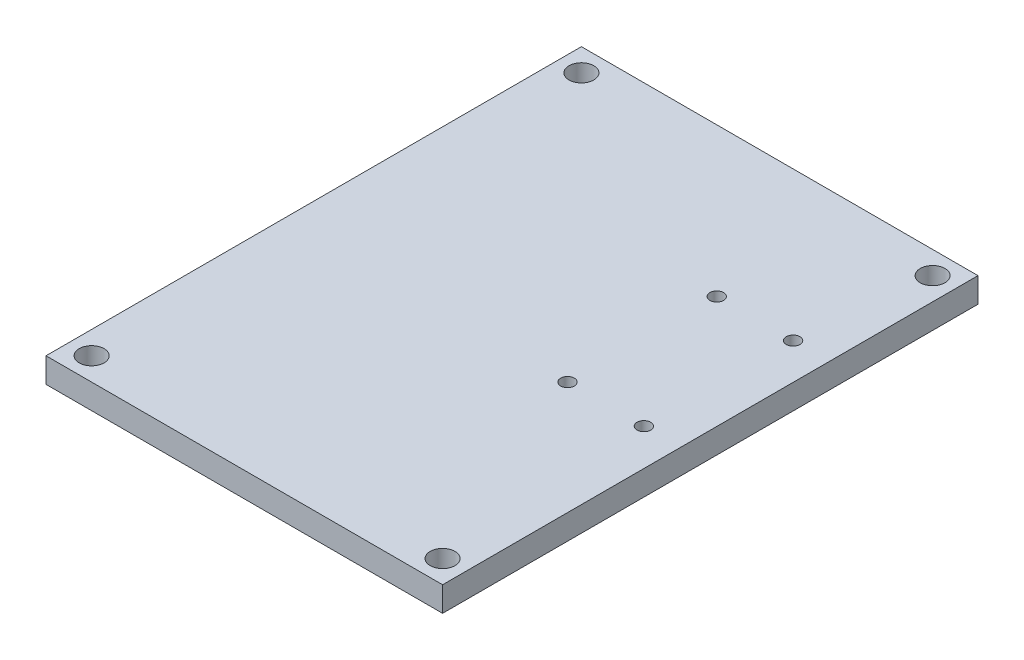
ISO-10303-21;
HEADER;
FILE_DESCRIPTION(('STEP AP214'),'2;1');
FILE_NAME('part.step','',(''),(''),'','','');
FILE_SCHEMA(('AUTOMOTIVE_DESIGN { 1 0 10303 214 1 1 1 1 }'));
ENDSEC;
DATA;
#1=APPLICATION_CONTEXT('core data for automotive mechanical design processes');
#2=APPLICATION_PROTOCOL_DEFINITION('international standard','automotive_design',2000,#1);
#3=PRODUCT_CONTEXT('',#1,'mechanical');
#4=PRODUCT('Part','Part','',(#3));
#5=PRODUCT_RELATED_PRODUCT_CATEGORY('part','',(#4));
#6=PRODUCT_DEFINITION_FORMATION('','',#4);
#7=PRODUCT_DEFINITION_CONTEXT('part definition',#1,'design');
#8=PRODUCT_DEFINITION('design','',#6,#7);
#9=PRODUCT_DEFINITION_SHAPE('','',#8);
#10=(LENGTH_UNIT() NAMED_UNIT(*) SI_UNIT(.MILLI.,.METRE.));
#11=(NAMED_UNIT(*) PLANE_ANGLE_UNIT() SI_UNIT($,.RADIAN.));
#12=(NAMED_UNIT(*) SI_UNIT($,.STERADIAN.) SOLID_ANGLE_UNIT());
#13=UNCERTAINTY_MEASURE_WITH_UNIT(LENGTH_MEASURE(1.E-05),#10,'distance_accuracy_value','');
#14=(GEOMETRIC_REPRESENTATION_CONTEXT(3) GLOBAL_UNCERTAINTY_ASSIGNED_CONTEXT((#13)) GLOBAL_UNIT_ASSIGNED_CONTEXT((#10,
#11,#12)) REPRESENTATION_CONTEXT('',''));
#15=CARTESIAN_POINT('',(0.,0.,0.));
#16=DIRECTION('',(0.,0.,1.));
#17=DIRECTION('',(1.,0.,0.));
#18=AXIS2_PLACEMENT_3D('',#15,#16,#17);
#19=CARTESIAN_POINT('',(-50.8,6.35,-68.58));
#20=DIRECTION('',(0.,0.,-1.));
#21=DIRECTION('',(-1.,0.,0.));
#22=AXIS2_PLACEMENT_3D('',#19,#20,#21);
#23=PLANE('',#22);
#24=DIRECTION('',(1.,0.,0.));
#25=VECTOR('',#24,1.);
#26=CARTESIAN_POINT('',(-50.8,0.,-68.58));
#27=LINE('',#26,#25);
#28=CARTESIAN_POINT('',(-50.8,0.,-68.58));
#29=VERTEX_POINT('',#28);
#30=CARTESIAN_POINT('',(50.8,0.,-68.58));
#31=VERTEX_POINT('',#30);
#32=EDGE_CURVE('E102',#29,#31,#27,.T.);
#33=ORIENTED_EDGE('',*,*,#32,.F.);
#34=DIRECTION('',(0.,-1.,0.));
#35=VECTOR('',#34,1.);
#36=CARTESIAN_POINT('',(-50.8,6.35,-68.58));
#37=LINE('',#36,#35);
#38=CARTESIAN_POINT('',(-50.8,6.35,-68.58));
#39=VERTEX_POINT('',#38);
#40=EDGE_CURVE('E11',#39,#29,#37,.T.);
#41=ORIENTED_EDGE('',*,*,#40,.F.);
#42=DIRECTION('',(1.,0.,0.));
#43=VECTOR('',#42,1.);
#44=CARTESIAN_POINT('',(-50.8,6.35,-68.58));
#45=LINE('',#44,#43);
#46=CARTESIAN_POINT('',(50.8,6.35,-68.58));
#47=VERTEX_POINT('',#46);
#48=EDGE_CURVE('E95',#39,#47,#45,.T.);
#49=ORIENTED_EDGE('',*,*,#48,.T.);
#50=DIRECTION('',(0.,-1.,0.));
#51=VECTOR('',#50,1.);
#52=CARTESIAN_POINT('',(50.8,6.35,-68.58));
#53=LINE('',#52,#51);
#54=EDGE_CURVE('E40',#47,#31,#53,.T.);
#55=ORIENTED_EDGE('',*,*,#54,.T.);
#56=EDGE_LOOP('',(#33,#41,#49,#55));
#57=FACE_BOUND('',#56,.T.);
#58=ADVANCED_FACE('F37',(#57),#23,.T.);
#59=CARTESIAN_POINT('',(-50.8,6.35,68.58));
#60=DIRECTION('',(-1.,0.,0.));
#61=DIRECTION('',(0.,0.,1.));
#62=AXIS2_PLACEMENT_3D('',#59,#60,#61);
#63=PLANE('',#62);
#64=DIRECTION('',(0.,0.,-1.));
#65=VECTOR('',#64,1.);
#66=CARTESIAN_POINT('',(-50.8,0.,68.58));
#67=LINE('',#66,#65);
#68=CARTESIAN_POINT('',(-50.8,0.,68.58));
#69=VERTEX_POINT('',#68);
#70=EDGE_CURVE('E97',#69,#29,#67,.T.);
#71=ORIENTED_EDGE('',*,*,#70,.F.);
#72=DIRECTION('',(0.,-1.,0.));
#73=VECTOR('',#72,1.);
#74=CARTESIAN_POINT('',(-50.8,6.35,68.58));
#75=LINE('',#74,#73);
#76=CARTESIAN_POINT('',(-50.8,6.35,68.58));
#77=VERTEX_POINT('',#76);
#78=EDGE_CURVE('E46',#77,#69,#75,.T.);
#79=ORIENTED_EDGE('',*,*,#78,.F.);
#80=DIRECTION('',(0.,0.,-1.));
#81=VECTOR('',#80,1.);
#82=CARTESIAN_POINT('',(-50.8,6.35,68.58));
#83=LINE('',#82,#81);
#84=EDGE_CURVE('E85',#77,#39,#83,.T.);
#85=ORIENTED_EDGE('',*,*,#84,.T.);
#86=ORIENTED_EDGE('',*,*,#40,.T.);
#87=EDGE_LOOP('',(#71,#79,#85,#86));
#88=FACE_BOUND('',#87,.T.);
#89=ADVANCED_FACE('F113',(#88),#63,.T.);
#90=CARTESIAN_POINT('',(-50.8,6.35,68.58));
#91=DIRECTION('',(0.,0.,-1.));
#92=DIRECTION('',(-1.,0.,0.));
#93=AXIS2_PLACEMENT_3D('',#90,#91,#92);
#94=PLANE('',#93);
#95=DIRECTION('',(1.,0.,0.));
#96=VECTOR('',#95,1.);
#97=CARTESIAN_POINT('',(-50.8,0.,68.58));
#98=LINE('',#97,#96);
#99=CARTESIAN_POINT('',(50.8,0.,68.58));
#100=VERTEX_POINT('',#99);
#101=EDGE_CURVE('E90',#69,#100,#98,.T.);
#102=ORIENTED_EDGE('',*,*,#101,.T.);
#103=DIRECTION('',(0.,-1.,0.));
#104=VECTOR('',#103,1.);
#105=CARTESIAN_POINT('',(50.8,6.35,68.58));
#106=LINE('',#105,#104);
#107=CARTESIAN_POINT('',(50.8,6.35,68.58));
#108=VERTEX_POINT('',#107);
#109=EDGE_CURVE('E88',#108,#100,#106,.T.);
#110=ORIENTED_EDGE('',*,*,#109,.F.);
#111=DIRECTION('',(1.,0.,0.));
#112=VECTOR('',#111,1.);
#113=CARTESIAN_POINT('',(-50.8,6.35,68.58));
#114=LINE('',#113,#112);
#115=EDGE_CURVE('E82',#77,#108,#114,.T.);
#116=ORIENTED_EDGE('',*,*,#115,.F.);
#117=ORIENTED_EDGE('',*,*,#78,.T.);
#118=EDGE_LOOP('',(#102,#110,#116,#117));
#119=FACE_BOUND('',#118,.T.);
#120=ADVANCED_FACE('F89',(#119),#94,.F.);
#121=CARTESIAN_POINT('',(50.8,6.35,68.58));
#122=DIRECTION('',(-1.,0.,0.));
#123=DIRECTION('',(0.,0.,1.));
#124=AXIS2_PLACEMENT_3D('',#121,#122,#123);
#125=PLANE('',#124);
#126=DIRECTION('',(0.,0.,-1.));
#127=VECTOR('',#126,1.);
#128=CARTESIAN_POINT('',(50.8,0.,68.58));
#129=LINE('',#128,#127);
#130=EDGE_CURVE('E105',#100,#31,#129,.T.);
#131=ORIENTED_EDGE('',*,*,#130,.T.);
#132=ORIENTED_EDGE('',*,*,#54,.F.);
#133=DIRECTION('',(0.,0.,-1.));
#134=VECTOR('',#133,1.);
#135=CARTESIAN_POINT('',(50.8,6.35,68.58));
#136=LINE('',#135,#134);
#137=EDGE_CURVE('E79',#108,#47,#136,.T.);
#138=ORIENTED_EDGE('',*,*,#137,.F.);
#139=ORIENTED_EDGE('',*,*,#109,.T.);
#140=EDGE_LOOP('',(#131,#132,#138,#139));
#141=FACE_BOUND('',#140,.T.);
#142=ADVANCED_FACE('F94',(#141),#125,.F.);
#143=CARTESIAN_POINT('',(0.,6.35,0.));
#144=DIRECTION('',(0.,1.,0.));
#145=DIRECTION('',(0.,0.,1.));
#146=AXIS2_PLACEMENT_3D('',#143,#144,#145);
#147=PLANE('',#146);
#148=CARTESIAN_POINT('',(41.529,6.35,-30.48));
#149=DIRECTION('',(0.,1.,0.));
#150=DIRECTION('',(0.,0.,1.));
#151=AXIS2_PLACEMENT_3D('',#148,#149,#150);
#152=CIRCLE('',#151,1.7526);
#153=CARTESIAN_POINT('',(41.529,6.35,-28.7274));
#154=VERTEX_POINT('',#153);
#155=EDGE_CURVE('E184',#154,#154,#152,.T.);
#156=ORIENTED_EDGE('',*,*,#155,.F.);
#157=EDGE_LOOP('',(#156));
#158=FACE_BOUND('',#157,.T.);
#159=CARTESIAN_POINT('',(21.844,6.35,7.62));
#160=DIRECTION('',(0.,1.,0.));
#161=DIRECTION('',(0.,0.,1.));
#162=AXIS2_PLACEMENT_3D('',#159,#160,#161);
#163=CIRCLE('',#162,1.7526);
#164=CARTESIAN_POINT('',(21.844,6.35,9.3726));
#165=VERTEX_POINT('',#164);
#166=EDGE_CURVE('E177',#165,#165,#163,.T.);
#167=ORIENTED_EDGE('',*,*,#166,.F.);
#168=EDGE_LOOP('',(#167));
#169=FACE_BOUND('',#168,.T.);
#170=CARTESIAN_POINT('',(41.402,6.35,7.61999999999999));
#171=DIRECTION('',(0.,1.,0.));
#172=DIRECTION('',(0.,0.,1.));
#173=AXIS2_PLACEMENT_3D('',#170,#171,#172);
#174=CIRCLE('',#173,1.7526);
#175=CARTESIAN_POINT('',(41.402,6.35,9.37259999999998));
#176=VERTEX_POINT('',#175);
#177=EDGE_CURVE('E174',#176,#176,#174,.T.);
#178=ORIENTED_EDGE('',*,*,#177,.F.);
#179=EDGE_LOOP('',(#178));
#180=FACE_BOUND('',#179,.T.);
#181=CARTESIAN_POINT('',(21.971,6.35,-30.48));
#182=DIRECTION('',(0.,1.,0.));
#183=DIRECTION('',(0.,0.,1.));
#184=AXIS2_PLACEMENT_3D('',#181,#182,#183);
#185=CIRCLE('',#184,1.7526);
#186=CARTESIAN_POINT('',(21.971,6.35,-28.7274));
#187=VERTEX_POINT('',#186);
#188=EDGE_CURVE('E183',#187,#187,#185,.T.);
#189=ORIENTED_EDGE('',*,*,#188,.F.);
#190=EDGE_LOOP('',(#189));
#191=FACE_BOUND('',#190,.T.);
#192=CARTESIAN_POINT('',(44.9836929897545,6.35,-62.7636929897545));
#193=DIRECTION('',(0.,1.,0.));
#194=DIRECTION('',(0.,0.,1.));
#195=AXIS2_PLACEMENT_3D('',#192,#193,#194);
#196=CIRCLE('',#195,3.17500000000001);
#197=CARTESIAN_POINT('',(44.9836929897545,6.35,-59.5886929897545));
#198=VERTEX_POINT('',#197);
#199=EDGE_CURVE('E208',#198,#198,#196,.T.);
#200=ORIENTED_EDGE('',*,*,#199,.F.);
#201=EDGE_LOOP('',(#200));
#202=FACE_BOUND('',#201,.T.);
#203=CARTESIAN_POINT('',(-44.9514295692859,6.35,62.7314295692859));
#204=DIRECTION('',(0.,1.,0.));
#205=DIRECTION('',(0.,0.,1.));
#206=AXIS2_PLACEMENT_3D('',#203,#204,#205);
#207=CIRCLE('',#206,3.175);
#208=CARTESIAN_POINT('',(-44.9514295692859,6.35,65.9064295692859));
#209=VERTEX_POINT('',#208);
#210=EDGE_CURVE('E201',#209,#209,#207,.T.);
#211=ORIENTED_EDGE('',*,*,#210,.F.);
#212=EDGE_LOOP('',(#211));
#213=FACE_BOUND('',#212,.T.);
#214=CARTESIAN_POINT('',(44.9836929897545,6.35,62.7636929897545));
#215=DIRECTION('',(0.,1.,0.));
#216=DIRECTION('',(0.,0.,1.));
#217=AXIS2_PLACEMENT_3D('',#214,#215,#216);
#218=CIRCLE('',#217,3.175);
#219=CARTESIAN_POINT('',(44.9836929897545,6.35,65.9386929897545));
#220=VERTEX_POINT('',#219);
#221=EDGE_CURVE('E195',#220,#220,#218,.T.);
#222=ORIENTED_EDGE('',*,*,#221,.F.);
#223=EDGE_LOOP('',(#222));
#224=FACE_BOUND('',#223,.T.);
#225=CARTESIAN_POINT('',(-44.9887929778248,6.35,-62.7687929778247));
#226=DIRECTION('',(0.,1.,0.));
#227=DIRECTION('',(0.,0.,1.));
#228=AXIS2_PLACEMENT_3D('',#225,#226,#227);
#229=CIRCLE('',#228,3.17500000000003);
#230=CARTESIAN_POINT('',(-44.9887929778248,6.35,-59.5937929778247));
#231=VERTEX_POINT('',#230);
#232=EDGE_CURVE('E207',#231,#231,#229,.T.);
#233=ORIENTED_EDGE('',*,*,#232,.F.);
#234=EDGE_LOOP('',(#233));
#235=FACE_BOUND('',#234,.T.);
#236=ORIENTED_EDGE('',*,*,#48,.F.);
#237=ORIENTED_EDGE('',*,*,#84,.F.);
#238=ORIENTED_EDGE('',*,*,#115,.T.);
#239=ORIENTED_EDGE('',*,*,#137,.T.);
#240=EDGE_LOOP('',(#236,#237,#238,#239));
#241=FACE_BOUND('',#240,.T.);
#242=ADVANCED_FACE('F84',(#158,#169,#180,#191,#202,#213,#224,#235,#241),#147,.T.);
#243=CARTESIAN_POINT('',(0.,0.,0.));
#244=DIRECTION('',(0.,1.,0.));
#245=DIRECTION('',(0.,0.,1.));
#246=AXIS2_PLACEMENT_3D('',#243,#244,#245);
#247=PLANE('',#246);
#248=CARTESIAN_POINT('',(41.529,0.,-30.48));
#249=DIRECTION('',(0.,1.,0.));
#250=DIRECTION('',(0.,0.,1.));
#251=AXIS2_PLACEMENT_3D('',#248,#249,#250);
#252=CIRCLE('',#251,1.7526);
#253=CARTESIAN_POINT('',(41.529,0.,-28.7274));
#254=VERTEX_POINT('',#253);
#255=EDGE_CURVE('E180',#254,#254,#252,.T.);
#256=ORIENTED_EDGE('',*,*,#255,.T.);
#257=EDGE_LOOP('',(#256));
#258=FACE_BOUND('',#257,.T.);
#259=CARTESIAN_POINT('',(21.844,0.,7.62));
#260=DIRECTION('',(0.,1.,0.));
#261=DIRECTION('',(0.,0.,1.));
#262=AXIS2_PLACEMENT_3D('',#259,#260,#261);
#263=CIRCLE('',#262,1.7526);
#264=CARTESIAN_POINT('',(21.844,0.,9.3726));
#265=VERTEX_POINT('',#264);
#266=EDGE_CURVE('E187',#265,#265,#263,.T.);
#267=ORIENTED_EDGE('',*,*,#266,.T.);
#268=EDGE_LOOP('',(#267));
#269=FACE_BOUND('',#268,.T.);
#270=CARTESIAN_POINT('',(41.402,0.,7.61999999999999));
#271=DIRECTION('',(0.,1.,0.));
#272=DIRECTION('',(0.,0.,1.));
#273=AXIS2_PLACEMENT_3D('',#270,#271,#272);
#274=CIRCLE('',#273,1.7526);
#275=CARTESIAN_POINT('',(41.402,0.,9.37259999999998));
#276=VERTEX_POINT('',#275);
#277=EDGE_CURVE('E171',#276,#276,#274,.T.);
#278=ORIENTED_EDGE('',*,*,#277,.T.);
#279=EDGE_LOOP('',(#278));
#280=FACE_BOUND('',#279,.T.);
#281=CARTESIAN_POINT('',(21.971,0.,-30.48));
#282=DIRECTION('',(0.,1.,0.));
#283=DIRECTION('',(0.,0.,1.));
#284=AXIS2_PLACEMENT_3D('',#281,#282,#283);
#285=CIRCLE('',#284,1.7526);
#286=CARTESIAN_POINT('',(21.971,0.,-28.7274));
#287=VERTEX_POINT('',#286);
#288=EDGE_CURVE('E192',#287,#287,#285,.T.);
#289=ORIENTED_EDGE('',*,*,#288,.T.);
#290=EDGE_LOOP('',(#289));
#291=FACE_BOUND('',#290,.T.);
#292=CARTESIAN_POINT('',(44.9836929897545,0.,-62.7636929897545));
#293=DIRECTION('',(0.,1.,0.));
#294=DIRECTION('',(0.,0.,1.));
#295=AXIS2_PLACEMENT_3D('',#292,#293,#294);
#296=CIRCLE('',#295,3.17500000000001);
#297=CARTESIAN_POINT('',(44.9836929897545,0.,-59.5886929897545));
#298=VERTEX_POINT('',#297);
#299=EDGE_CURVE('E204',#298,#298,#296,.T.);
#300=ORIENTED_EDGE('',*,*,#299,.T.);
#301=EDGE_LOOP('',(#300));
#302=FACE_BOUND('',#301,.T.);
#303=CARTESIAN_POINT('',(-44.9514295692859,0.,62.7314295692859));
#304=DIRECTION('',(0.,1.,0.));
#305=DIRECTION('',(0.,0.,1.));
#306=AXIS2_PLACEMENT_3D('',#303,#304,#305);
#307=CIRCLE('',#306,3.175);
#308=CARTESIAN_POINT('',(-44.9514295692859,0.,65.9064295692859));
#309=VERTEX_POINT('',#308);
#310=EDGE_CURVE('E211',#309,#309,#307,.T.);
#311=ORIENTED_EDGE('',*,*,#310,.T.);
#312=EDGE_LOOP('',(#311));
#313=FACE_BOUND('',#312,.T.);
#314=CARTESIAN_POINT('',(44.9836929897545,0.,62.7636929897545));
#315=DIRECTION('',(0.,1.,0.));
#316=DIRECTION('',(0.,0.,1.));
#317=AXIS2_PLACEMENT_3D('',#314,#315,#316);
#318=CIRCLE('',#317,3.175);
#319=CARTESIAN_POINT('',(44.9836929897545,0.,65.9386929897545));
#320=VERTEX_POINT('',#319);
#321=EDGE_CURVE('E198',#320,#320,#318,.T.);
#322=ORIENTED_EDGE('',*,*,#321,.T.);
#323=EDGE_LOOP('',(#322));
#324=FACE_BOUND('',#323,.T.);
#325=CARTESIAN_POINT('',(-44.9887929778248,0.,-62.7687929778247));
#326=DIRECTION('',(0.,1.,0.));
#327=DIRECTION('',(0.,0.,1.));
#328=AXIS2_PLACEMENT_3D('',#325,#326,#327);
#329=CIRCLE('',#328,3.17500000000003);
#330=CARTESIAN_POINT('',(-44.9887929778248,0.,-59.5937929778247));
#331=VERTEX_POINT('',#330);
#332=EDGE_CURVE('E106',#331,#331,#329,.T.);
#333=ORIENTED_EDGE('',*,*,#332,.T.);
#334=EDGE_LOOP('',(#333));
#335=FACE_BOUND('',#334,.T.);
#336=ORIENTED_EDGE('',*,*,#32,.T.);
#337=ORIENTED_EDGE('',*,*,#130,.F.);
#338=ORIENTED_EDGE('',*,*,#101,.F.);
#339=ORIENTED_EDGE('',*,*,#70,.T.);
#340=EDGE_LOOP('',(#336,#337,#338,#339));
#341=FACE_BOUND('',#340,.T.);
#342=ADVANCED_FACE('F112',(#258,#269,#280,#291,#302,#313,#324,#335,#341),#247,.F.);
#343=CARTESIAN_POINT('',(-44.9887929778248,0.,-62.7687929778247));
#344=DIRECTION('',(0.,1.,0.));
#345=DIRECTION('',(0.,0.,1.));
#346=AXIS2_PLACEMENT_3D('',#343,#344,#345);
#347=CYLINDRICAL_SURFACE('',#346,3.17500000000003);
#348=ORIENTED_EDGE('',*,*,#332,.F.);
#349=EDGE_LOOP('',(#348));
#350=FACE_BOUND('',#349,.T.);
#351=ORIENTED_EDGE('',*,*,#232,.T.);
#352=EDGE_LOOP('',(#351));
#353=FACE_BOUND('',#352,.T.);
#354=ADVANCED_FACE('F131',(#350,#353),#347,.F.);
#355=CARTESIAN_POINT('',(44.9836929897545,0.,62.7636929897545));
#356=DIRECTION('',(0.,1.,0.));
#357=DIRECTION('',(0.,0.,1.));
#358=AXIS2_PLACEMENT_3D('',#355,#356,#357);
#359=CYLINDRICAL_SURFACE('',#358,3.175);
#360=ORIENTED_EDGE('',*,*,#321,.F.);
#361=EDGE_LOOP('',(#360));
#362=FACE_BOUND('',#361,.T.);
#363=ORIENTED_EDGE('',*,*,#221,.T.);
#364=EDGE_LOOP('',(#363));
#365=FACE_BOUND('',#364,.T.);
#366=ADVANCED_FACE('F138',(#362,#365),#359,.F.);
#367=CARTESIAN_POINT('',(-44.9514295692859,0.,62.7314295692859));
#368=DIRECTION('',(0.,1.,0.));
#369=DIRECTION('',(0.,0.,1.));
#370=AXIS2_PLACEMENT_3D('',#367,#368,#369);
#371=CYLINDRICAL_SURFACE('',#370,3.175);
#372=ORIENTED_EDGE('',*,*,#310,.F.);
#373=EDGE_LOOP('',(#372));
#374=FACE_BOUND('',#373,.T.);
#375=ORIENTED_EDGE('',*,*,#210,.T.);
#376=EDGE_LOOP('',(#375));
#377=FACE_BOUND('',#376,.T.);
#378=ADVANCED_FACE('F140',(#374,#377),#371,.F.);
#379=CARTESIAN_POINT('',(44.9836929897545,0.,-62.7636929897545));
#380=DIRECTION('',(0.,1.,0.));
#381=DIRECTION('',(0.,0.,1.));
#382=AXIS2_PLACEMENT_3D('',#379,#380,#381);
#383=CYLINDRICAL_SURFACE('',#382,3.17500000000001);
#384=ORIENTED_EDGE('',*,*,#299,.F.);
#385=EDGE_LOOP('',(#384));
#386=FACE_BOUND('',#385,.T.);
#387=ORIENTED_EDGE('',*,*,#199,.T.);
#388=EDGE_LOOP('',(#387));
#389=FACE_BOUND('',#388,.T.);
#390=ADVANCED_FACE('F143',(#386,#389),#383,.F.);
#391=CARTESIAN_POINT('',(21.971,0.,-30.48));
#392=DIRECTION('',(0.,1.,0.));
#393=DIRECTION('',(0.,0.,1.));
#394=AXIS2_PLACEMENT_3D('',#391,#392,#393);
#395=CYLINDRICAL_SURFACE('',#394,1.7526);
#396=ORIENTED_EDGE('',*,*,#288,.F.);
#397=EDGE_LOOP('',(#396));
#398=FACE_BOUND('',#397,.T.);
#399=ORIENTED_EDGE('',*,*,#188,.T.);
#400=EDGE_LOOP('',(#399));
#401=FACE_BOUND('',#400,.T.);
#402=ADVANCED_FACE('F147',(#398,#401),#395,.F.);
#403=CARTESIAN_POINT('',(41.402,0.,7.61999999999999));
#404=DIRECTION('',(0.,1.,0.));
#405=DIRECTION('',(0.,0.,1.));
#406=AXIS2_PLACEMENT_3D('',#403,#404,#405);
#407=CYLINDRICAL_SURFACE('',#406,1.7526);
#408=ORIENTED_EDGE('',*,*,#277,.F.);
#409=EDGE_LOOP('',(#408));
#410=FACE_BOUND('',#409,.T.);
#411=ORIENTED_EDGE('',*,*,#177,.T.);
#412=EDGE_LOOP('',(#411));
#413=FACE_BOUND('',#412,.T.);
#414=ADVANCED_FACE('F154',(#410,#413),#407,.F.);
#415=CARTESIAN_POINT('',(21.844,0.,7.62));
#416=DIRECTION('',(0.,1.,0.));
#417=DIRECTION('',(0.,0.,1.));
#418=AXIS2_PLACEMENT_3D('',#415,#416,#417);
#419=CYLINDRICAL_SURFACE('',#418,1.7526);
#420=ORIENTED_EDGE('',*,*,#266,.F.);
#421=EDGE_LOOP('',(#420));
#422=FACE_BOUND('',#421,.T.);
#423=ORIENTED_EDGE('',*,*,#166,.T.);
#424=EDGE_LOOP('',(#423));
#425=FACE_BOUND('',#424,.T.);
#426=ADVANCED_FACE('F156',(#422,#425),#419,.F.);
#427=CARTESIAN_POINT('',(41.529,0.,-30.48));
#428=DIRECTION('',(0.,1.,0.));
#429=DIRECTION('',(0.,0.,1.));
#430=AXIS2_PLACEMENT_3D('',#427,#428,#429);
#431=CYLINDRICAL_SURFACE('',#430,1.7526);
#432=ORIENTED_EDGE('',*,*,#255,.F.);
#433=EDGE_LOOP('',(#432));
#434=FACE_BOUND('',#433,.T.);
#435=ORIENTED_EDGE('',*,*,#155,.T.);
#436=EDGE_LOOP('',(#435));
#437=FACE_BOUND('',#436,.T.);
#438=ADVANCED_FACE('F159',(#434,#437),#431,.F.);
#439=CLOSED_SHELL('',(#58,#89,#120,#142,#242,#342,#354,#366,#378,#390,#402,#414,#426,#438));
#440=MANIFOLD_SOLID_BREP('B2',#439);
#441=ADVANCED_BREP_SHAPE_REPRESENTATION('',(#18,#440),#14);
#442=SHAPE_DEFINITION_REPRESENTATION(#9,#441);
ENDSEC;
END-ISO-10303-21;
